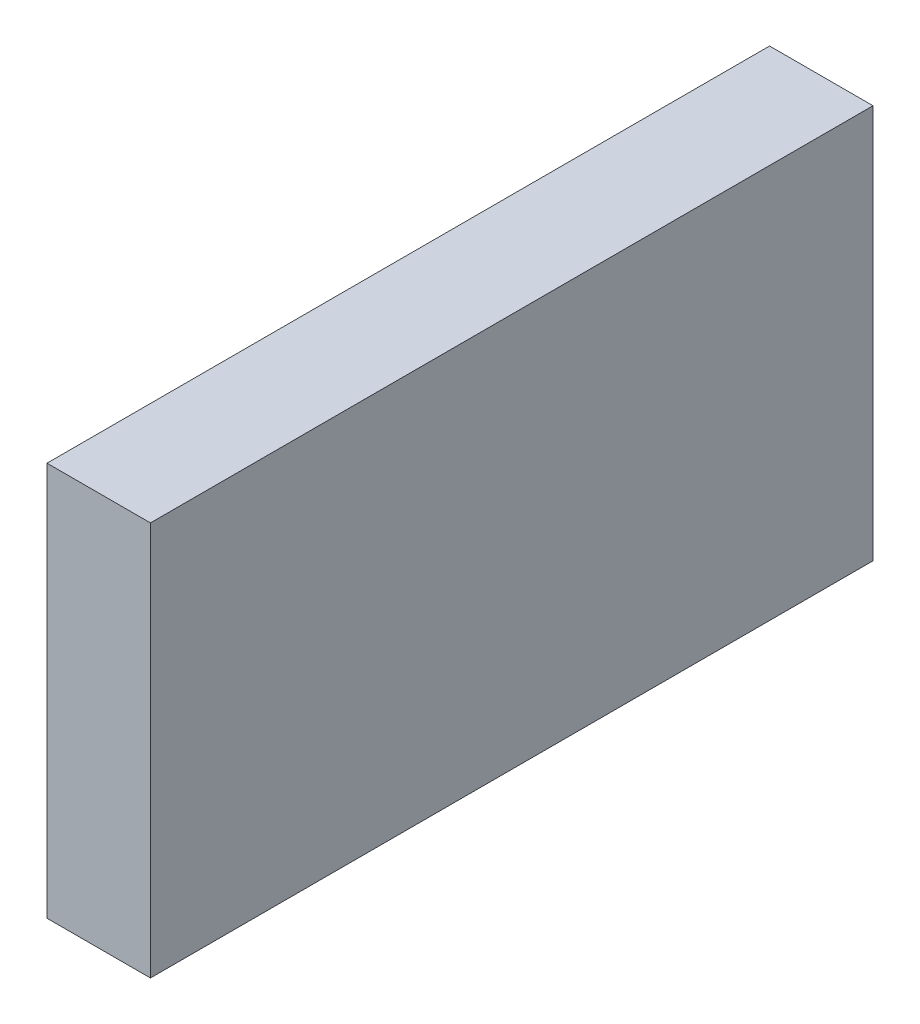
ISO-10303-21;
HEADER;
FILE_DESCRIPTION(('STEP AP214'),'2;1');
FILE_NAME('part.step','',(''),(''),'','','');
FILE_SCHEMA(('AUTOMOTIVE_DESIGN { 1 0 10303 214 1 1 1 1 }'));
ENDSEC;
DATA;
#1=APPLICATION_CONTEXT('core data for automotive mechanical design processes');
#2=APPLICATION_PROTOCOL_DEFINITION('international standard','automotive_design',2000,#1);
#3=PRODUCT_CONTEXT('',#1,'mechanical');
#4=PRODUCT('Part','Part','',(#3));
#5=PRODUCT_RELATED_PRODUCT_CATEGORY('part','',(#4));
#6=PRODUCT_DEFINITION_FORMATION('','',#4);
#7=PRODUCT_DEFINITION_CONTEXT('part definition',#1,'design');
#8=PRODUCT_DEFINITION('design','',#6,#7);
#9=PRODUCT_DEFINITION_SHAPE('','',#8);
#10=(LENGTH_UNIT() NAMED_UNIT(*) SI_UNIT(.MILLI.,.METRE.));
#11=(NAMED_UNIT(*) PLANE_ANGLE_UNIT() SI_UNIT($,.RADIAN.));
#12=(NAMED_UNIT(*) SI_UNIT($,.STERADIAN.) SOLID_ANGLE_UNIT());
#13=UNCERTAINTY_MEASURE_WITH_UNIT(LENGTH_MEASURE(1.E-05),#10,'distance_accuracy_value','');
#14=(GEOMETRIC_REPRESENTATION_CONTEXT(3) GLOBAL_UNCERTAINTY_ASSIGNED_CONTEXT((#13)) GLOBAL_UNIT_ASSIGNED_CONTEXT((#10,
#11,#12)) REPRESENTATION_CONTEXT('',''));
#15=CARTESIAN_POINT('',(0.,0.,0.));
#16=DIRECTION('',(0.,0.,1.));
#17=DIRECTION('',(1.,0.,0.));
#18=AXIS2_PLACEMENT_3D('',#15,#16,#17);
#19=CARTESIAN_POINT('',(7.57409638554213,-22.2632530120482,69.85));
#20=DIRECTION('',(-1.,0.,0.));
#21=DIRECTION('',(0.,0.,1.));
#22=AXIS2_PLACEMENT_3D('',#19,#20,#21);
#23=PLANE('',#22);
#24=DIRECTION('',(0.,1.,0.));
#25=VECTOR('',#24,1.);
#26=CARTESIAN_POINT('',(7.57409638554213,-22.2632530120482,0.));
#27=LINE('',#26,#25);
#28=CARTESIAN_POINT('',(7.57409638554213,-22.2632530120482,0.));
#29=VERTEX_POINT('',#28);
#30=CARTESIAN_POINT('',(7.57409638554213,15.8367469879518,0.));
#31=VERTEX_POINT('',#30);
#32=EDGE_CURVE('E102',#29,#31,#27,.T.);
#33=ORIENTED_EDGE('',*,*,#32,.T.);
#34=DIRECTION('',(0.,0.,-1.));
#35=VECTOR('',#34,1.);
#36=CARTESIAN_POINT('',(7.57409638554213,15.8367469879518,69.85));
#37=LINE('',#36,#35);
#38=CARTESIAN_POINT('',(7.57409638554213,15.8367469879518,69.85));
#39=VERTEX_POINT('',#38);
#40=EDGE_CURVE('E11',#39,#31,#37,.T.);
#41=ORIENTED_EDGE('',*,*,#40,.F.);
#42=DIRECTION('',(0.,1.,0.));
#43=VECTOR('',#42,1.);
#44=CARTESIAN_POINT('',(7.57409638554213,-22.2632530120482,69.85));
#45=LINE('',#44,#43);
#46=CARTESIAN_POINT('',(7.57409638554213,-22.2632530120482,69.85));
#47=VERTEX_POINT('',#46);
#48=EDGE_CURVE('E90',#47,#39,#45,.T.);
#49=ORIENTED_EDGE('',*,*,#48,.F.);
#50=DIRECTION('',(0.,0.,-1.));
#51=VECTOR('',#50,1.);
#52=CARTESIAN_POINT('',(7.57409638554213,-22.2632530120482,69.85));
#53=LINE('',#52,#51);
#54=EDGE_CURVE('E98',#47,#29,#53,.T.);
#55=ORIENTED_EDGE('',*,*,#54,.T.);
#56=EDGE_LOOP('',(#33,#41,#49,#55));
#57=FACE_BOUND('',#56,.T.);
#58=ADVANCED_FACE('F39',(#57),#23,.F.);
#59=CARTESIAN_POINT('',(-2.42590361445787,15.8367469879518,69.85));
#60=DIRECTION('',(0.,-1.,0.));
#61=DIRECTION('',(0.,0.,-1.));
#62=AXIS2_PLACEMENT_3D('',#59,#60,#61);
#63=PLANE('',#62);
#64=DIRECTION('',(-1.,0.,0.));
#65=VECTOR('',#64,1.);
#66=CARTESIAN_POINT('',(-2.42590361445787,15.8367469879518,0.));
#67=LINE('',#66,#65);
#68=CARTESIAN_POINT('',(-2.42590361445787,15.8367469879518,0.));
#69=VERTEX_POINT('',#68);
#70=EDGE_CURVE('E94',#31,#69,#67,.T.);
#71=ORIENTED_EDGE('',*,*,#70,.T.);
#72=DIRECTION('',(0.,0.,-1.));
#73=VECTOR('',#72,1.);
#74=CARTESIAN_POINT('',(-2.42590361445787,15.8367469879518,69.85));
#75=LINE('',#74,#73);
#76=CARTESIAN_POINT('',(-2.42590361445787,15.8367469879518,69.85));
#77=VERTEX_POINT('',#76);
#78=EDGE_CURVE('E47',#77,#69,#75,.T.);
#79=ORIENTED_EDGE('',*,*,#78,.F.);
#80=DIRECTION('',(-1.,0.,0.));
#81=VECTOR('',#80,1.);
#82=CARTESIAN_POINT('',(-2.42590361445787,15.8367469879518,69.85));
#83=LINE('',#82,#81);
#84=EDGE_CURVE('E85',#39,#77,#83,.T.);
#85=ORIENTED_EDGE('',*,*,#84,.F.);
#86=ORIENTED_EDGE('',*,*,#40,.T.);
#87=EDGE_LOOP('',(#71,#79,#85,#86));
#88=FACE_BOUND('',#87,.T.);
#89=ADVANCED_FACE('F93',(#88),#63,.F.);
#90=CARTESIAN_POINT('',(-2.42590361445787,-22.2632530120482,69.85));
#91=DIRECTION('',(1.,0.,0.));
#92=DIRECTION('',(0.,0.,-1.));
#93=AXIS2_PLACEMENT_3D('',#90,#91,#92);
#94=PLANE('',#93);
#95=DIRECTION('',(0.,-1.,0.));
#96=VECTOR('',#95,1.);
#97=CARTESIAN_POINT('',(-2.42590361445787,-22.2632530120482,0.));
#98=LINE('',#97,#96);
#99=CARTESIAN_POINT('',(-2.42590361445787,-22.2632530120482,0.));
#100=VERTEX_POINT('',#99);
#101=EDGE_CURVE('E72',#69,#100,#98,.T.);
#102=ORIENTED_EDGE('',*,*,#101,.T.);
#103=DIRECTION('',(0.,0.,-1.));
#104=VECTOR('',#103,1.);
#105=CARTESIAN_POINT('',(-2.42590361445787,-22.2632530120482,69.85));
#106=LINE('',#105,#104);
#107=CARTESIAN_POINT('',(-2.42590361445787,-22.2632530120482,69.85));
#108=VERTEX_POINT('',#107);
#109=EDGE_CURVE('E95',#108,#100,#106,.T.);
#110=ORIENTED_EDGE('',*,*,#109,.F.);
#111=DIRECTION('',(0.,-1.,0.));
#112=VECTOR('',#111,1.);
#113=CARTESIAN_POINT('',(-2.42590361445787,-22.2632530120482,69.85));
#114=LINE('',#113,#112);
#115=EDGE_CURVE('E88',#77,#108,#114,.T.);
#116=ORIENTED_EDGE('',*,*,#115,.F.);
#117=ORIENTED_EDGE('',*,*,#78,.T.);
#118=EDGE_LOOP('',(#102,#110,#116,#117));
#119=FACE_BOUND('',#118,.T.);
#120=ADVANCED_FACE('F96',(#119),#94,.F.);
#121=CARTESIAN_POINT('',(-2.42590361445787,-22.2632530120482,69.85));
#122=DIRECTION('',(0.,1.,0.));
#123=DIRECTION('',(-1.,0.,0.));
#124=AXIS2_PLACEMENT_3D('',#121,#122,#123);
#125=PLANE('',#124);
#126=DIRECTION('',(1.,0.,0.));
#127=VECTOR('',#126,1.);
#128=CARTESIAN_POINT('',(-2.42590361445787,-22.2632530120482,0.));
#129=LINE('',#128,#127);
#130=EDGE_CURVE('E78',#100,#29,#129,.T.);
#131=ORIENTED_EDGE('',*,*,#130,.T.);
#132=ORIENTED_EDGE('',*,*,#54,.F.);
#133=DIRECTION('',(1.,0.,0.));
#134=VECTOR('',#133,1.);
#135=CARTESIAN_POINT('',(-2.42590361445787,-22.2632530120482,69.85));
#136=LINE('',#135,#134);
#137=EDGE_CURVE('E55',#108,#47,#136,.T.);
#138=ORIENTED_EDGE('',*,*,#137,.F.);
#139=ORIENTED_EDGE('',*,*,#109,.T.);
#140=EDGE_LOOP('',(#131,#132,#138,#139));
#141=FACE_BOUND('',#140,.T.);
#142=ADVANCED_FACE('F109',(#141),#125,.F.);
#143=CARTESIAN_POINT('',(0.,0.,69.85));
#144=DIRECTION('',(0.,0.,-1.));
#145=DIRECTION('',(-1.,0.,0.));
#146=AXIS2_PLACEMENT_3D('',#143,#144,#145);
#147=PLANE('',#146);
#148=ORIENTED_EDGE('',*,*,#48,.T.);
#149=ORIENTED_EDGE('',*,*,#84,.T.);
#150=ORIENTED_EDGE('',*,*,#115,.T.);
#151=ORIENTED_EDGE('',*,*,#137,.T.);
#152=EDGE_LOOP('',(#148,#149,#150,#151));
#153=FACE_BOUND('',#152,.T.);
#154=ADVANCED_FACE('F86',(#153),#147,.F.);
#155=CARTESIAN_POINT('',(0.,0.,0.));
#156=DIRECTION('',(0.,0.,-1.));
#157=DIRECTION('',(-1.,0.,0.));
#158=AXIS2_PLACEMENT_3D('',#155,#156,#157);
#159=PLANE('',#158);
#160=ORIENTED_EDGE('',*,*,#32,.F.);
#161=ORIENTED_EDGE('',*,*,#130,.F.);
#162=ORIENTED_EDGE('',*,*,#101,.F.);
#163=ORIENTED_EDGE('',*,*,#70,.F.);
#164=EDGE_LOOP('',(#160,#161,#162,#163));
#165=FACE_BOUND('',#164,.T.);
#166=ADVANCED_FACE('F112',(#165),#159,.T.);
#167=CLOSED_SHELL('',(#58,#89,#120,#142,#154,#166));
#168=MANIFOLD_SOLID_BREP('B2',#167);
#169=ADVANCED_BREP_SHAPE_REPRESENTATION('',(#18,#168),#14);
#170=SHAPE_DEFINITION_REPRESENTATION(#9,#169);
ENDSEC;
END-ISO-10303-21;
